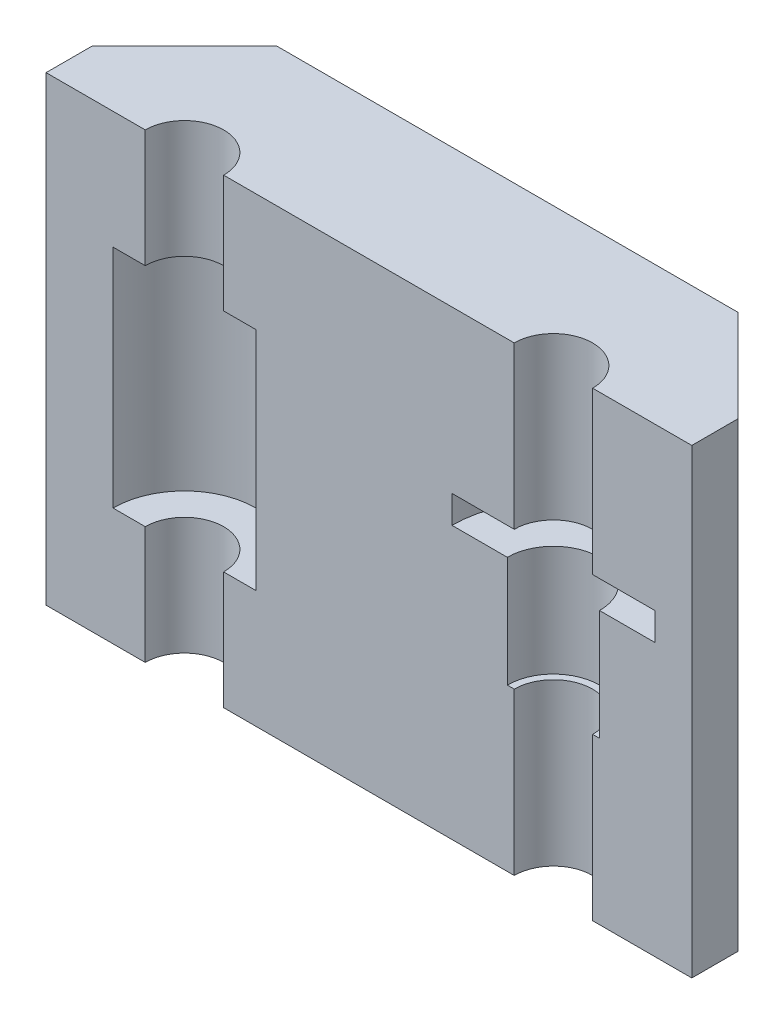
ISO-10303-21;
HEADER;
FILE_DESCRIPTION(('STEP AP214'),'2;1');
FILE_NAME('part.step','',(''),(''),'','','');
FILE_SCHEMA(('AUTOMOTIVE_DESIGN { 1 0 10303 214 1 1 1 1 }'));
ENDSEC;
DATA;
#1=APPLICATION_CONTEXT('core data for automotive mechanical design processes');
#2=APPLICATION_PROTOCOL_DEFINITION('international standard','automotive_design',2000,#1);
#3=PRODUCT_CONTEXT('',#1,'mechanical');
#4=PRODUCT('Part','Part','',(#3));
#5=PRODUCT_RELATED_PRODUCT_CATEGORY('part','',(#4));
#6=PRODUCT_DEFINITION_FORMATION('','',#4);
#7=PRODUCT_DEFINITION_CONTEXT('part definition',#1,'design');
#8=PRODUCT_DEFINITION('design','',#6,#7);
#9=PRODUCT_DEFINITION_SHAPE('','',#8);
#10=(LENGTH_UNIT() NAMED_UNIT(*) SI_UNIT(.MILLI.,.METRE.));
#11=(NAMED_UNIT(*) PLANE_ANGLE_UNIT() SI_UNIT($,.RADIAN.));
#12=(NAMED_UNIT(*) SI_UNIT($,.STERADIAN.) SOLID_ANGLE_UNIT());
#13=UNCERTAINTY_MEASURE_WITH_UNIT(LENGTH_MEASURE(1.E-05),#10,'distance_accuracy_value','');
#14=(GEOMETRIC_REPRESENTATION_CONTEXT(3) GLOBAL_UNCERTAINTY_ASSIGNED_CONTEXT((#13)) GLOBAL_UNIT_ASSIGNED_CONTEXT((#10,
#11,#12)) REPRESENTATION_CONTEXT('',''));
#15=CARTESIAN_POINT('',(0.,0.,0.));
#16=DIRECTION('',(0.,0.,1.));
#17=DIRECTION('',(1.,0.,0.));
#18=AXIS2_PLACEMENT_3D('',#15,#16,#17);
#19=CARTESIAN_POINT('',(20.,-25.,15.));
#20=DIRECTION('',(0.,1.,0.));
#21=DIRECTION('',(0.,0.,1.));
#22=AXIS2_PLACEMENT_3D('',#19,#20,#21);
#23=CYLINDRICAL_SURFACE('',#22,4.25);
#24=CARTESIAN_POINT('',(20.,-7.5,15.));
#25=DIRECTION('',(0.,1.,0.));
#26=DIRECTION('',(0.,0.,1.));
#27=AXIS2_PLACEMENT_3D('',#24,#25,#26);
#28=CIRCLE('',#27,4.25);
#29=CARTESIAN_POINT('',(15.75,-7.5,15.));
#30=VERTEX_POINT('',#29);
#31=CARTESIAN_POINT('',(24.25,-7.5,15.));
#32=VERTEX_POINT('',#31);
#33=EDGE_CURVE('E178',#30,#32,#28,.F.);
#34=ORIENTED_EDGE('',*,*,#33,.F.);
#35=DIRECTION('',(0.,1.,0.));
#36=VECTOR('',#35,1.);
#37=CARTESIAN_POINT('',(15.75,-25.,15.));
#38=LINE('',#37,#36);
#39=CARTESIAN_POINT('',(15.75,-25.,15.));
#40=VERTEX_POINT('',#39);
#41=EDGE_CURVE('E285',#40,#30,#38,.T.);
#42=ORIENTED_EDGE('',*,*,#41,.F.);
#43=CARTESIAN_POINT('',(20.,-25.,15.));
#44=DIRECTION('',(0.,1.,0.));
#45=DIRECTION('',(0.,0.,1.));
#46=AXIS2_PLACEMENT_3D('',#43,#44,#45);
#47=CIRCLE('',#46,4.25);
#48=CARTESIAN_POINT('',(24.25,-25.,15.));
#49=VERTEX_POINT('',#48);
#50=EDGE_CURVE('E244',#49,#40,#47,.T.);
#51=ORIENTED_EDGE('',*,*,#50,.F.);
#52=DIRECTION('',(0.,1.,0.));
#53=VECTOR('',#52,1.);
#54=CARTESIAN_POINT('',(24.25,-25.,15.));
#55=LINE('',#54,#53);
#56=EDGE_CURVE('E280',#32,#49,#55,.F.);
#57=ORIENTED_EDGE('',*,*,#56,.F.);
#58=EDGE_LOOP('',(#34,#42,#51,#57));
#59=FACE_BOUND('',#58,.T.);
#60=ADVANCED_FACE('F33',(#59),#23,.F.);
#61=CARTESIAN_POINT('',(0.,0.,15.));
#62=DIRECTION('',(0.,0.,-1.));
#63=DIRECTION('',(-1.,0.,0.));
#64=AXIS2_PLACEMENT_3D('',#61,#62,#63);
#65=PLANE('',#64);
#66=DIRECTION('',(1.,0.,0.));
#67=VECTOR('',#66,1.);
#68=CARTESIAN_POINT('',(0.,-7.5,15.));
#69=LINE('',#68,#67);
#70=CARTESIAN_POINT('',(15.,-7.5,15.));
#71=VERTEX_POINT('',#70);
#72=EDGE_CURVE('E182',#71,#30,#69,.T.);
#73=ORIENTED_EDGE('',*,*,#72,.F.);
#74=DIRECTION('',(0.,1.,0.));
#75=VECTOR('',#74,1.);
#76=CARTESIAN_POINT('',(15.,-7.5,15.));
#77=LINE('',#76,#75);
#78=CARTESIAN_POINT('',(15.,4.5,15.));
#79=VERTEX_POINT('',#78);
#80=EDGE_CURVE('E183',#71,#79,#77,.T.);
#81=ORIENTED_EDGE('',*,*,#80,.T.);
#82=DIRECTION('',(1.,0.,0.));
#83=VECTOR('',#82,1.);
#84=CARTESIAN_POINT('',(0.,4.5,15.));
#85=LINE('',#84,#83);
#86=CARTESIAN_POINT('',(9.00000000000001,4.5,15.));
#87=VERTEX_POINT('',#86);
#88=EDGE_CURVE('E212',#87,#79,#85,.T.);
#89=ORIENTED_EDGE('',*,*,#88,.F.);
#90=DIRECTION('',(0.,1.,0.));
#91=VECTOR('',#90,1.);
#92=CARTESIAN_POINT('',(9.00000000000001,4.5,15.));
#93=LINE('',#92,#91);
#94=CARTESIAN_POINT('',(9.00000000000001,7.5,15.));
#95=VERTEX_POINT('',#94);
#96=EDGE_CURVE('E215',#87,#95,#93,.T.);
#97=ORIENTED_EDGE('',*,*,#96,.T.);
#98=DIRECTION('',(1.,0.,0.));
#99=VECTOR('',#98,1.);
#100=CARTESIAN_POINT('',(0.,7.5,15.));
#101=LINE('',#100,#99);
#102=CARTESIAN_POINT('',(15.75,7.5,15.));
#103=VERTEX_POINT('',#102);
#104=EDGE_CURVE('E209',#95,#103,#101,.T.);
#105=ORIENTED_EDGE('',*,*,#104,.T.);
#106=CARTESIAN_POINT('',(15.75,25.,15.));
#107=VERTEX_POINT('',#106);
#108=EDGE_CURVE('E284',#103,#107,#38,.T.);
#109=ORIENTED_EDGE('',*,*,#108,.T.);
#110=DIRECTION('',(-1.,0.,0.));
#111=VECTOR('',#110,1.);
#112=CARTESIAN_POINT('',(-35.,25.,15.));
#113=LINE('',#112,#111);
#114=CARTESIAN_POINT('',(-15.75,25.,15.));
#115=VERTEX_POINT('',#114);
#116=EDGE_CURVE('E258',#107,#115,#113,.T.);
#117=ORIENTED_EDGE('',*,*,#116,.T.);
#118=DIRECTION('',(0.,1.,0.));
#119=VECTOR('',#118,1.);
#120=CARTESIAN_POINT('',(-15.75,-25.,15.));
#121=LINE('',#120,#119);
#122=CARTESIAN_POINT('',(-15.75,12.25,15.));
#123=VERTEX_POINT('',#122);
#124=EDGE_CURVE('E289',#115,#123,#121,.F.);
#125=ORIENTED_EDGE('',*,*,#124,.T.);
#126=DIRECTION('',(1.,0.,0.));
#127=VECTOR('',#126,1.);
#128=CARTESIAN_POINT('',(0.,12.25,15.));
#129=LINE('',#128,#127);
#130=CARTESIAN_POINT('',(-12.25,12.25,15.));
#131=VERTEX_POINT('',#130);
#132=EDGE_CURVE('E228',#123,#131,#129,.T.);
#133=ORIENTED_EDGE('',*,*,#132,.T.);
#134=DIRECTION('',(0.,-1.,0.));
#135=VECTOR('',#134,1.);
#136=CARTESIAN_POINT('',(-12.25,12.25,15.));
#137=LINE('',#136,#135);
#138=CARTESIAN_POINT('',(-12.25,-12.25,15.));
#139=VERTEX_POINT('',#138);
#140=EDGE_CURVE('E301',#139,#131,#137,.F.);
#141=ORIENTED_EDGE('',*,*,#140,.F.);
#142=DIRECTION('',(1.,0.,0.));
#143=VECTOR('',#142,1.);
#144=CARTESIAN_POINT('',(0.,-12.25,15.));
#145=LINE('',#144,#143);
#146=CARTESIAN_POINT('',(-15.75,-12.25,15.));
#147=VERTEX_POINT('',#146);
#148=EDGE_CURVE('E224',#147,#139,#145,.T.);
#149=ORIENTED_EDGE('',*,*,#148,.F.);
#150=CARTESIAN_POINT('',(-15.75,-25.,15.));
#151=VERTEX_POINT('',#150);
#152=EDGE_CURVE('E288',#147,#151,#121,.F.);
#153=ORIENTED_EDGE('',*,*,#152,.T.);
#154=DIRECTION('',(1.,0.,0.));
#155=VECTOR('',#154,1.);
#156=CARTESIAN_POINT('',(-35.,-25.,15.));
#157=LINE('',#156,#155);
#158=EDGE_CURVE('E265',#151,#40,#157,.T.);
#159=ORIENTED_EDGE('',*,*,#158,.T.);
#160=ORIENTED_EDGE('',*,*,#41,.T.);
#161=EDGE_LOOP('',(#73,#81,#89,#97,#105,#109,#117,#125,#133,#141,#149,#153,#159,#160));
#162=FACE_BOUND('',#161,.T.);
#163=ADVANCED_FACE('F350',(#162),#65,.F.);
#164=DIRECTION('',(1.,0.,0.));
#165=VECTOR('',#164,1.);
#166=CARTESIAN_POINT('',(0.,4.5,15.));
#167=LINE('',#166,#165);
#168=CARTESIAN_POINT('',(25.,4.5,15.));
#169=VERTEX_POINT('',#168);
#170=CARTESIAN_POINT('',(31.,4.5,15.));
#171=VERTEX_POINT('',#170);
#172=EDGE_CURVE('E195',#169,#171,#167,.T.);
#173=ORIENTED_EDGE('',*,*,#172,.F.);
#174=DIRECTION('',(0.,1.,0.));
#175=VECTOR('',#174,1.);
#176=CARTESIAN_POINT('',(25.,-7.5,15.));
#177=LINE('',#176,#175);
#178=CARTESIAN_POINT('',(25.,-7.5,15.));
#179=VERTEX_POINT('',#178);
#180=EDGE_CURVE('E187',#169,#179,#177,.F.);
#181=ORIENTED_EDGE('',*,*,#180,.T.);
#182=DIRECTION('',(1.,0.,0.));
#183=VECTOR('',#182,1.);
#184=CARTESIAN_POINT('',(0.,-7.5,15.));
#185=LINE('',#184,#183);
#186=EDGE_CURVE('E172',#32,#179,#185,.T.);
#187=ORIENTED_EDGE('',*,*,#186,.F.);
#188=ORIENTED_EDGE('',*,*,#56,.T.);
#189=CARTESIAN_POINT('',(35.,-25.,15.));
#190=VERTEX_POINT('',#189);
#191=EDGE_CURVE('E260',#49,#190,#157,.T.);
#192=ORIENTED_EDGE('',*,*,#191,.T.);
#193=DIRECTION('',(0.,1.,0.));
#194=VECTOR('',#193,1.);
#195=CARTESIAN_POINT('',(35.,-25.,15.));
#196=LINE('',#195,#194);
#197=CARTESIAN_POINT('',(35.,25.,15.));
#198=VERTEX_POINT('',#197);
#199=EDGE_CURVE('E249',#190,#198,#196,.T.);
#200=ORIENTED_EDGE('',*,*,#199,.T.);
#201=CARTESIAN_POINT('',(24.25,25.,15.));
#202=VERTEX_POINT('',#201);
#203=EDGE_CURVE('E254',#198,#202,#113,.T.);
#204=ORIENTED_EDGE('',*,*,#203,.T.);
#205=CARTESIAN_POINT('',(24.25,7.5,15.));
#206=VERTEX_POINT('',#205);
#207=EDGE_CURVE('E281',#202,#206,#55,.F.);
#208=ORIENTED_EDGE('',*,*,#207,.T.);
#209=DIRECTION('',(1.,0.,0.));
#210=VECTOR('',#209,1.);
#211=CARTESIAN_POINT('',(0.,7.5,15.));
#212=LINE('',#211,#210);
#213=CARTESIAN_POINT('',(31.,7.5,15.));
#214=VERTEX_POINT('',#213);
#215=EDGE_CURVE('E205',#206,#214,#212,.T.);
#216=ORIENTED_EDGE('',*,*,#215,.T.);
#217=DIRECTION('',(0.,1.,0.));
#218=VECTOR('',#217,1.);
#219=CARTESIAN_POINT('',(31.,4.5,15.));
#220=LINE('',#219,#218);
#221=EDGE_CURVE('E306',#214,#171,#220,.F.);
#222=ORIENTED_EDGE('',*,*,#221,.T.);
#223=EDGE_LOOP('',(#173,#181,#187,#188,#192,#200,#204,#208,#216,#222));
#224=FACE_BOUND('',#223,.T.);
#225=ADVANCED_FACE('F193',(#224),#65,.F.);
#226=CARTESIAN_POINT('',(-20.,-25.,15.));
#227=DIRECTION('',(0.,1.,0.));
#228=DIRECTION('',(0.,0.,1.));
#229=AXIS2_PLACEMENT_3D('',#226,#227,#228);
#230=CYLINDRICAL_SURFACE('',#229,4.25);
#231=CARTESIAN_POINT('',(-20.,-12.25,15.));
#232=DIRECTION('',(0.,1.,0.));
#233=DIRECTION('',(0.,0.,1.));
#234=AXIS2_PLACEMENT_3D('',#231,#232,#233);
#235=CIRCLE('',#234,4.25);
#236=CARTESIAN_POINT('',(-24.25,-12.25,15.));
#237=VERTEX_POINT('',#236);
#238=EDGE_CURVE('E296',#237,#147,#235,.F.);
#239=ORIENTED_EDGE('',*,*,#238,.F.);
#240=DIRECTION('',(0.,1.,0.));
#241=VECTOR('',#240,1.);
#242=CARTESIAN_POINT('',(-24.25,-25.,15.));
#243=LINE('',#242,#241);
#244=CARTESIAN_POINT('',(-24.25,-25.,15.));
#245=VERTEX_POINT('',#244);
#246=EDGE_CURVE('E293',#245,#237,#243,.T.);
#247=ORIENTED_EDGE('',*,*,#246,.F.);
#248=CARTESIAN_POINT('',(-20.,-25.,15.));
#249=DIRECTION('',(0.,1.,0.));
#250=DIRECTION('',(0.,0.,1.));
#251=AXIS2_PLACEMENT_3D('',#248,#249,#250);
#252=CIRCLE('',#251,4.25);
#253=EDGE_CURVE('E237',#151,#245,#252,.T.);
#254=ORIENTED_EDGE('',*,*,#253,.F.);
#255=ORIENTED_EDGE('',*,*,#152,.F.);
#256=EDGE_LOOP('',(#239,#247,#254,#255));
#257=FACE_BOUND('',#256,.T.);
#258=ADVANCED_FACE('F371',(#257),#230,.F.);
#259=DIRECTION('',(0.,-1.,0.));
#260=VECTOR('',#259,1.);
#261=CARTESIAN_POINT('',(-27.75,12.25,15.));
#262=LINE('',#261,#260);
#263=CARTESIAN_POINT('',(-27.75,12.25,15.));
#264=VERTEX_POINT('',#263);
#265=CARTESIAN_POINT('',(-27.75,-12.25,15.));
#266=VERTEX_POINT('',#265);
#267=EDGE_CURVE('E234',#264,#266,#262,.T.);
#268=ORIENTED_EDGE('',*,*,#267,.F.);
#269=DIRECTION('',(1.,0.,0.));
#270=VECTOR('',#269,1.);
#271=CARTESIAN_POINT('',(0.,12.25,15.));
#272=LINE('',#271,#270);
#273=CARTESIAN_POINT('',(-24.25,12.25,15.));
#274=VERTEX_POINT('',#273);
#275=EDGE_CURVE('E231',#264,#274,#272,.T.);
#276=ORIENTED_EDGE('',*,*,#275,.T.);
#277=CARTESIAN_POINT('',(-24.25,25.,15.));
#278=VERTEX_POINT('',#277);
#279=EDGE_CURVE('E292',#274,#278,#243,.T.);
#280=ORIENTED_EDGE('',*,*,#279,.T.);
#281=CARTESIAN_POINT('',(-35.,25.,15.));
#282=VERTEX_POINT('',#281);
#283=EDGE_CURVE('E252',#278,#282,#113,.T.);
#284=ORIENTED_EDGE('',*,*,#283,.T.);
#285=DIRECTION('',(0.,-1.,0.));
#286=VECTOR('',#285,1.);
#287=CARTESIAN_POINT('',(-35.,-25.,15.));
#288=LINE('',#287,#286);
#289=CARTESIAN_POINT('',(-35.,-25.,15.));
#290=VERTEX_POINT('',#289);
#291=EDGE_CURVE('E257',#282,#290,#288,.T.);
#292=ORIENTED_EDGE('',*,*,#291,.T.);
#293=EDGE_CURVE('E261',#290,#245,#157,.T.);
#294=ORIENTED_EDGE('',*,*,#293,.T.);
#295=ORIENTED_EDGE('',*,*,#246,.T.);
#296=DIRECTION('',(1.,0.,0.));
#297=VECTOR('',#296,1.);
#298=CARTESIAN_POINT('',(0.,-12.25,15.));
#299=LINE('',#298,#297);
#300=EDGE_CURVE('E226',#266,#237,#299,.T.);
#301=ORIENTED_EDGE('',*,*,#300,.F.);
#302=EDGE_LOOP('',(#268,#276,#280,#284,#292,#294,#295,#301));
#303=FACE_BOUND('',#302,.T.);
#304=ADVANCED_FACE('F344',(#303),#65,.F.);
#305=CARTESIAN_POINT('',(35.,-25.,15.));
#306=DIRECTION('',(-1.,0.,0.));
#307=DIRECTION('',(0.,0.,1.));
#308=AXIS2_PLACEMENT_3D('',#305,#306,#307);
#309=PLANE('',#308);
#310=DIRECTION('',(0.,0.,-1.));
#311=VECTOR('',#310,1.);
#312=CARTESIAN_POINT('',(35.,-25.,15.));
#313=LINE('',#312,#311);
#314=CARTESIAN_POINT('',(35.,-25.,9.99999999999999));
#315=VERTEX_POINT('',#314);
#316=EDGE_CURVE('E264',#190,#315,#313,.T.);
#317=ORIENTED_EDGE('',*,*,#316,.T.);
#318=DIRECTION('',(0.,1.,0.));
#319=VECTOR('',#318,1.);
#320=CARTESIAN_POINT('',(35.,25.,9.99999999999999));
#321=LINE('',#320,#319);
#322=CARTESIAN_POINT('',(35.,25.,9.99999999999999));
#323=VERTEX_POINT('',#322);
#324=EDGE_CURVE('E309',#315,#323,#321,.T.);
#325=ORIENTED_EDGE('',*,*,#324,.T.);
#326=DIRECTION('',(0.,0.,-1.));
#327=VECTOR('',#326,1.);
#328=CARTESIAN_POINT('',(35.,25.,15.));
#329=LINE('',#328,#327);
#330=EDGE_CURVE('E277',#198,#323,#329,.T.);
#331=ORIENTED_EDGE('',*,*,#330,.F.);
#332=ORIENTED_EDGE('',*,*,#199,.F.);
#333=EDGE_LOOP('',(#317,#325,#331,#332));
#334=FACE_BOUND('',#333,.T.);
#335=ADVANCED_FACE('F328',(#334),#309,.F.);
#336=CARTESIAN_POINT('',(-35.,25.,15.));
#337=DIRECTION('',(0.,-1.,0.));
#338=DIRECTION('',(0.,0.,-1.));
#339=AXIS2_PLACEMENT_3D('',#336,#337,#338);
#340=PLANE('',#339);
#341=ORIENTED_EDGE('',*,*,#330,.T.);
#342=DIRECTION('',(-0.707106781186549,0.,-0.707106781186546));
#343=VECTOR('',#342,1.);
#344=CARTESIAN_POINT('',(35.,25.,9.99999999999999));
#345=LINE('',#344,#343);
#346=CARTESIAN_POINT('',(25.,25.,0.));
#347=VERTEX_POINT('',#346);
#348=EDGE_CURVE('E314',#323,#347,#345,.T.);
#349=ORIENTED_EDGE('',*,*,#348,.T.);
#350=DIRECTION('',(-1.,0.,0.));
#351=VECTOR('',#350,1.);
#352=CARTESIAN_POINT('',(-35.,25.,0.));
#353=LINE('',#352,#351);
#354=CARTESIAN_POINT('',(-25.,25.,0.));
#355=VERTEX_POINT('',#354);
#356=EDGE_CURVE('E240',#347,#355,#353,.T.);
#357=ORIENTED_EDGE('',*,*,#356,.T.);
#358=DIRECTION('',(-0.707106781186549,0.,0.707106781186546));
#359=VECTOR('',#358,1.);
#360=CARTESIAN_POINT('',(-35.,25.,9.99999999999999));
#361=LINE('',#360,#359);
#362=CARTESIAN_POINT('',(-35.,25.,9.99999999999999));
#363=VERTEX_POINT('',#362);
#364=EDGE_CURVE('E312',#355,#363,#361,.T.);
#365=ORIENTED_EDGE('',*,*,#364,.T.);
#366=DIRECTION('',(0.,0.,-1.));
#367=VECTOR('',#366,1.);
#368=CARTESIAN_POINT('',(-35.,25.,15.));
#369=LINE('',#368,#367);
#370=EDGE_CURVE('E274',#282,#363,#369,.T.);
#371=ORIENTED_EDGE('',*,*,#370,.F.);
#372=ORIENTED_EDGE('',*,*,#283,.F.);
#373=CARTESIAN_POINT('',(-20.,25.,15.));
#374=DIRECTION('',(0.,1.,0.));
#375=DIRECTION('',(0.,0.,1.));
#376=AXIS2_PLACEMENT_3D('',#373,#374,#375);
#377=CIRCLE('',#376,4.25);
#378=EDGE_CURVE('E241',#115,#278,#377,.T.);
#379=ORIENTED_EDGE('',*,*,#378,.F.);
#380=ORIENTED_EDGE('',*,*,#116,.F.);
#381=CARTESIAN_POINT('',(20.,25.,15.));
#382=DIRECTION('',(0.,1.,0.));
#383=DIRECTION('',(0.,0.,1.));
#384=AXIS2_PLACEMENT_3D('',#381,#382,#383);
#385=CIRCLE('',#384,4.25);
#386=EDGE_CURVE('E236',#202,#107,#385,.T.);
#387=ORIENTED_EDGE('',*,*,#386,.F.);
#388=ORIENTED_EDGE('',*,*,#203,.F.);
#389=EDGE_LOOP('',(#341,#349,#357,#365,#371,#372,#379,#380,#387,#388));
#390=FACE_BOUND('',#389,.T.);
#391=ADVANCED_FACE('F332',(#390),#340,.F.);
#392=CARTESIAN_POINT('',(-35.,-25.,15.));
#393=DIRECTION('',(1.,0.,0.));
#394=DIRECTION('',(0.,0.,-1.));
#395=AXIS2_PLACEMENT_3D('',#392,#393,#394);
#396=PLANE('',#395);
#397=ORIENTED_EDGE('',*,*,#370,.T.);
#398=DIRECTION('',(0.,-1.,0.));
#399=VECTOR('',#398,1.);
#400=CARTESIAN_POINT('',(-35.,-25.,9.99999999999999));
#401=LINE('',#400,#399);
#402=CARTESIAN_POINT('',(-35.,-25.,9.99999999999999));
#403=VERTEX_POINT('',#402);
#404=EDGE_CURVE('E11',#363,#403,#401,.T.);
#405=ORIENTED_EDGE('',*,*,#404,.T.);
#406=DIRECTION('',(0.,0.,-1.));
#407=VECTOR('',#406,1.);
#408=CARTESIAN_POINT('',(-35.,-25.,15.));
#409=LINE('',#408,#407);
#410=EDGE_CURVE('E271',#290,#403,#409,.T.);
#411=ORIENTED_EDGE('',*,*,#410,.F.);
#412=ORIENTED_EDGE('',*,*,#291,.F.);
#413=EDGE_LOOP('',(#397,#405,#411,#412));
#414=FACE_BOUND('',#413,.T.);
#415=ADVANCED_FACE('F339',(#414),#396,.F.);
#416=CARTESIAN_POINT('',(-35.,-25.,15.));
#417=DIRECTION('',(0.,1.,0.));
#418=DIRECTION('',(0.,0.,1.));
#419=AXIS2_PLACEMENT_3D('',#416,#417,#418);
#420=PLANE('',#419);
#421=DIRECTION('',(1.,0.,0.));
#422=VECTOR('',#421,1.);
#423=CARTESIAN_POINT('',(-35.,-25.,0.));
#424=LINE('',#423,#422);
#425=CARTESIAN_POINT('',(-25.,-25.,0.));
#426=VERTEX_POINT('',#425);
#427=CARTESIAN_POINT('',(25.,-25.,0.));
#428=VERTEX_POINT('',#427);
#429=EDGE_CURVE('E253',#426,#428,#424,.T.);
#430=ORIENTED_EDGE('',*,*,#429,.T.);
#431=DIRECTION('',(0.707106781186549,0.,0.707106781186546));
#432=VECTOR('',#431,1.);
#433=CARTESIAN_POINT('',(35.,-25.,9.99999999999999));
#434=LINE('',#433,#432);
#435=EDGE_CURVE('E41',#428,#315,#434,.T.);
#436=ORIENTED_EDGE('',*,*,#435,.T.);
#437=ORIENTED_EDGE('',*,*,#316,.F.);
#438=ORIENTED_EDGE('',*,*,#191,.F.);
#439=ORIENTED_EDGE('',*,*,#50,.T.);
#440=ORIENTED_EDGE('',*,*,#158,.F.);
#441=ORIENTED_EDGE('',*,*,#253,.T.);
#442=ORIENTED_EDGE('',*,*,#293,.F.);
#443=ORIENTED_EDGE('',*,*,#410,.T.);
#444=DIRECTION('',(0.707106781186549,0.,-0.707106781186546));
#445=VECTOR('',#444,1.);
#446=CARTESIAN_POINT('',(-35.,-25.,9.99999999999999));
#447=LINE('',#446,#445);
#448=EDGE_CURVE('E48',#403,#426,#447,.T.);
#449=ORIENTED_EDGE('',*,*,#448,.T.);
#450=EDGE_LOOP('',(#430,#436,#437,#438,#439,#440,#441,#442,#443,#449));
#451=FACE_BOUND('',#450,.T.);
#452=ADVANCED_FACE('F322',(#451),#420,.F.);
#453=CARTESIAN_POINT('',(0.,0.,0.));
#454=DIRECTION('',(0.,0.,-1.));
#455=DIRECTION('',(-1.,0.,0.));
#456=AXIS2_PLACEMENT_3D('',#453,#454,#455);
#457=PLANE('',#456);
#458=ORIENTED_EDGE('',*,*,#356,.F.);
#459=DIRECTION('',(0.,-1.,0.));
#460=VECTOR('',#459,1.);
#461=CARTESIAN_POINT('',(25.,-25.,0.));
#462=LINE('',#461,#460);
#463=EDGE_CURVE('E55',#347,#428,#462,.T.);
#464=ORIENTED_EDGE('',*,*,#463,.T.);
#465=ORIENTED_EDGE('',*,*,#429,.F.);
#466=DIRECTION('',(0.,1.,0.));
#467=VECTOR('',#466,1.);
#468=CARTESIAN_POINT('',(-25.,25.,0.));
#469=LINE('',#468,#467);
#470=EDGE_CURVE('E316',#426,#355,#469,.T.);
#471=ORIENTED_EDGE('',*,*,#470,.T.);
#472=EDGE_LOOP('',(#458,#464,#465,#471));
#473=FACE_BOUND('',#472,.T.);
#474=ADVANCED_FACE('F334',(#473),#457,.T.);
#475=ORIENTED_EDGE('',*,*,#108,.F.);
#476=CARTESIAN_POINT('',(20.,7.5,15.));
#477=DIRECTION('',(0.,1.,0.));
#478=DIRECTION('',(0.,0.,1.));
#479=AXIS2_PLACEMENT_3D('',#476,#477,#478);
#480=CIRCLE('',#479,4.25);
#481=EDGE_CURVE('E303',#103,#206,#480,.F.);
#482=ORIENTED_EDGE('',*,*,#481,.T.);
#483=ORIENTED_EDGE('',*,*,#207,.F.);
#484=ORIENTED_EDGE('',*,*,#386,.T.);
#485=EDGE_LOOP('',(#475,#482,#483,#484));
#486=FACE_BOUND('',#485,.T.);
#487=ADVANCED_FACE('F387',(#486),#23,.F.);
#488=ORIENTED_EDGE('',*,*,#279,.F.);
#489=CARTESIAN_POINT('',(-20.,12.25,15.));
#490=DIRECTION('',(0.,1.,0.));
#491=DIRECTION('',(0.,0.,1.));
#492=AXIS2_PLACEMENT_3D('',#489,#490,#491);
#493=CIRCLE('',#492,4.25);
#494=EDGE_CURVE('E298',#274,#123,#493,.F.);
#495=ORIENTED_EDGE('',*,*,#494,.T.);
#496=ORIENTED_EDGE('',*,*,#124,.F.);
#497=ORIENTED_EDGE('',*,*,#378,.T.);
#498=EDGE_LOOP('',(#488,#495,#496,#497));
#499=FACE_BOUND('',#498,.T.);
#500=ADVANCED_FACE('F354',(#499),#230,.F.);
#501=CARTESIAN_POINT('',(-20.,12.25,15.));
#502=DIRECTION('',(0.,-1.,0.));
#503=DIRECTION('',(0.,0.,-1.));
#504=AXIS2_PLACEMENT_3D('',#501,#502,#503);
#505=CYLINDRICAL_SURFACE('',#504,7.75);
#506=ORIENTED_EDGE('',*,*,#267,.T.);
#507=CARTESIAN_POINT('',(-20.,-12.25,15.));
#508=DIRECTION('',(0.,1.,0.));
#509=DIRECTION('',(0.,0.,1.));
#510=AXIS2_PLACEMENT_3D('',#507,#508,#509);
#511=CIRCLE('',#510,7.75);
#512=EDGE_CURVE('E218',#139,#266,#511,.T.);
#513=ORIENTED_EDGE('',*,*,#512,.F.);
#514=ORIENTED_EDGE('',*,*,#140,.T.);
#515=CARTESIAN_POINT('',(-20.,12.25,15.));
#516=DIRECTION('',(0.,1.,0.));
#517=DIRECTION('',(0.,0.,1.));
#518=AXIS2_PLACEMENT_3D('',#515,#516,#517);
#519=CIRCLE('',#518,7.75);
#520=EDGE_CURVE('E221',#131,#264,#519,.T.);
#521=ORIENTED_EDGE('',*,*,#520,.T.);
#522=EDGE_LOOP('',(#506,#513,#514,#521));
#523=FACE_BOUND('',#522,.T.);
#524=ADVANCED_FACE('F361',(#523),#505,.F.);
#525=CARTESIAN_POINT('',(-20.,12.25,15.));
#526=DIRECTION('',(0.,1.,0.));
#527=DIRECTION('',(0.,0.,1.));
#528=AXIS2_PLACEMENT_3D('',#525,#526,#527);
#529=PLANE('',#528);
#530=ORIENTED_EDGE('',*,*,#520,.F.);
#531=ORIENTED_EDGE('',*,*,#132,.F.);
#532=ORIENTED_EDGE('',*,*,#494,.F.);
#533=ORIENTED_EDGE('',*,*,#275,.F.);
#534=EDGE_LOOP('',(#530,#531,#532,#533));
#535=FACE_BOUND('',#534,.T.);
#536=ADVANCED_FACE('F357',(#535),#529,.F.);
#537=CARTESIAN_POINT('',(-20.,-12.25,15.));
#538=DIRECTION('',(0.,1.,0.));
#539=DIRECTION('',(0.,0.,1.));
#540=AXIS2_PLACEMENT_3D('',#537,#538,#539);
#541=PLANE('',#540);
#542=ORIENTED_EDGE('',*,*,#300,.T.);
#543=ORIENTED_EDGE('',*,*,#238,.T.);
#544=ORIENTED_EDGE('',*,*,#148,.T.);
#545=ORIENTED_EDGE('',*,*,#512,.T.);
#546=EDGE_LOOP('',(#542,#543,#544,#545));
#547=FACE_BOUND('',#546,.T.);
#548=ADVANCED_FACE('F364',(#547),#541,.T.);
#549=CARTESIAN_POINT('',(20.,4.5,15.));
#550=DIRECTION('',(0.,1.,0.));
#551=DIRECTION('',(0.,0.,1.));
#552=AXIS2_PLACEMENT_3D('',#549,#550,#551);
#553=CYLINDRICAL_SURFACE('',#552,11.);
#554=CARTESIAN_POINT('',(20.,4.5,15.));
#555=DIRECTION('',(0.,1.,0.));
#556=DIRECTION('',(0.,0.,1.));
#557=AXIS2_PLACEMENT_3D('',#554,#555,#556);
#558=CIRCLE('',#557,11.);
#559=EDGE_CURVE('E202',#171,#87,#558,.T.);
#560=ORIENTED_EDGE('',*,*,#559,.F.);
#561=ORIENTED_EDGE('',*,*,#221,.F.);
#562=CARTESIAN_POINT('',(20.,7.5,15.));
#563=DIRECTION('',(0.,1.,0.));
#564=DIRECTION('',(0.,0.,1.));
#565=AXIS2_PLACEMENT_3D('',#562,#563,#564);
#566=CIRCLE('',#565,11.);
#567=EDGE_CURVE('E201',#214,#95,#566,.T.);
#568=ORIENTED_EDGE('',*,*,#567,.T.);
#569=ORIENTED_EDGE('',*,*,#96,.F.);
#570=EDGE_LOOP('',(#560,#561,#568,#569));
#571=FACE_BOUND('',#570,.T.);
#572=ADVANCED_FACE('F381',(#571),#553,.F.);
#573=CARTESIAN_POINT('',(20.,4.5,15.));
#574=DIRECTION('',(0.,1.,0.));
#575=DIRECTION('',(0.,0.,1.));
#576=AXIS2_PLACEMENT_3D('',#573,#574,#575);
#577=PLANE('',#576);
#578=CARTESIAN_POINT('',(20.,4.5,15.));
#579=DIRECTION('',(0.,1.,0.));
#580=DIRECTION('',(0.,0.,1.));
#581=AXIS2_PLACEMENT_3D('',#578,#579,#580);
#582=CIRCLE('',#581,5.);
#583=EDGE_CURVE('E190',#169,#79,#582,.T.);
#584=ORIENTED_EDGE('',*,*,#583,.F.);
#585=ORIENTED_EDGE('',*,*,#172,.T.);
#586=ORIENTED_EDGE('',*,*,#559,.T.);
#587=ORIENTED_EDGE('',*,*,#88,.T.);
#588=EDGE_LOOP('',(#584,#585,#586,#587));
#589=FACE_BOUND('',#588,.T.);
#590=ADVANCED_FACE('F377',(#589),#577,.T.);
#591=CARTESIAN_POINT('',(20.,7.5,15.));
#592=DIRECTION('',(0.,1.,0.));
#593=DIRECTION('',(0.,0.,1.));
#594=AXIS2_PLACEMENT_3D('',#591,#592,#593);
#595=PLANE('',#594);
#596=ORIENTED_EDGE('',*,*,#567,.F.);
#597=ORIENTED_EDGE('',*,*,#215,.F.);
#598=ORIENTED_EDGE('',*,*,#481,.F.);
#599=ORIENTED_EDGE('',*,*,#104,.F.);
#600=EDGE_LOOP('',(#596,#597,#598,#599));
#601=FACE_BOUND('',#600,.T.);
#602=ADVANCED_FACE('F385',(#601),#595,.F.);
#603=CARTESIAN_POINT('',(20.,-7.5,15.));
#604=DIRECTION('',(0.,1.,0.));
#605=DIRECTION('',(0.,0.,1.));
#606=AXIS2_PLACEMENT_3D('',#603,#604,#605);
#607=PLANE('',#606);
#608=ORIENTED_EDGE('',*,*,#72,.T.);
#609=ORIENTED_EDGE('',*,*,#33,.T.);
#610=ORIENTED_EDGE('',*,*,#186,.T.);
#611=CARTESIAN_POINT('',(20.,-7.5,15.));
#612=DIRECTION('',(0.,1.,0.));
#613=DIRECTION('',(0.,0.,1.));
#614=AXIS2_PLACEMENT_3D('',#611,#612,#613);
#615=CIRCLE('',#614,5.);
#616=EDGE_CURVE('E175',#179,#71,#615,.T.);
#617=ORIENTED_EDGE('',*,*,#616,.T.);
#618=EDGE_LOOP('',(#608,#609,#610,#617));
#619=FACE_BOUND('',#618,.T.);
#620=ADVANCED_FACE('F174',(#619),#607,.T.);
#621=CARTESIAN_POINT('',(20.,-7.5,15.));
#622=DIRECTION('',(0.,1.,0.));
#623=DIRECTION('',(0.,0.,1.));
#624=AXIS2_PLACEMENT_3D('',#621,#622,#623);
#625=CYLINDRICAL_SURFACE('',#624,5.);
#626=ORIENTED_EDGE('',*,*,#616,.F.);
#627=ORIENTED_EDGE('',*,*,#180,.F.);
#628=ORIENTED_EDGE('',*,*,#583,.T.);
#629=ORIENTED_EDGE('',*,*,#80,.F.);
#630=EDGE_LOOP('',(#626,#627,#628,#629));
#631=FACE_BOUND('',#630,.T.);
#632=ADVANCED_FACE('F186',(#631),#625,.F.);
#633=CARTESIAN_POINT('',(35.,-25.,9.99999999999999));
#634=DIRECTION('',(0.707106781186546,0.,-0.707106781186549));
#635=DIRECTION('',(0.,-1.,0.));
#636=AXIS2_PLACEMENT_3D('',#633,#634,#635);
#637=PLANE('',#636);
#638=ORIENTED_EDGE('',*,*,#435,.F.);
#639=ORIENTED_EDGE('',*,*,#463,.F.);
#640=ORIENTED_EDGE('',*,*,#348,.F.);
#641=ORIENTED_EDGE('',*,*,#324,.F.);
#642=EDGE_LOOP('',(#638,#639,#640,#641));
#643=FACE_BOUND('',#642,.T.);
#644=ADVANCED_FACE('F330',(#643),#637,.T.);
#645=CARTESIAN_POINT('',(-35.,-25.,9.99999999999999));
#646=DIRECTION('',(-0.707106781186546,0.,-0.707106781186549));
#647=DIRECTION('',(0.,1.,0.));
#648=AXIS2_PLACEMENT_3D('',#645,#646,#647);
#649=PLANE('',#648);
#650=ORIENTED_EDGE('',*,*,#364,.F.);
#651=ORIENTED_EDGE('',*,*,#470,.F.);
#652=ORIENTED_EDGE('',*,*,#448,.F.);
#653=ORIENTED_EDGE('',*,*,#404,.F.);
#654=EDGE_LOOP('',(#650,#651,#652,#653));
#655=FACE_BOUND('',#654,.T.);
#656=ADVANCED_FACE('F35',(#655),#649,.T.);
#657=CLOSED_SHELL('',(#60,#163,#225,#258,#304,#335,#391,#415,#452,#474,#487,#500,#524,#536,#548,
#572,#590,#602,#620,#632,#644,#656));
#658=MANIFOLD_SOLID_BREP('B2',#657);
#659=ADVANCED_BREP_SHAPE_REPRESENTATION('',(#18,#658),#14);
#660=SHAPE_DEFINITION_REPRESENTATION(#9,#659);
ENDSEC;
END-ISO-10303-21;
